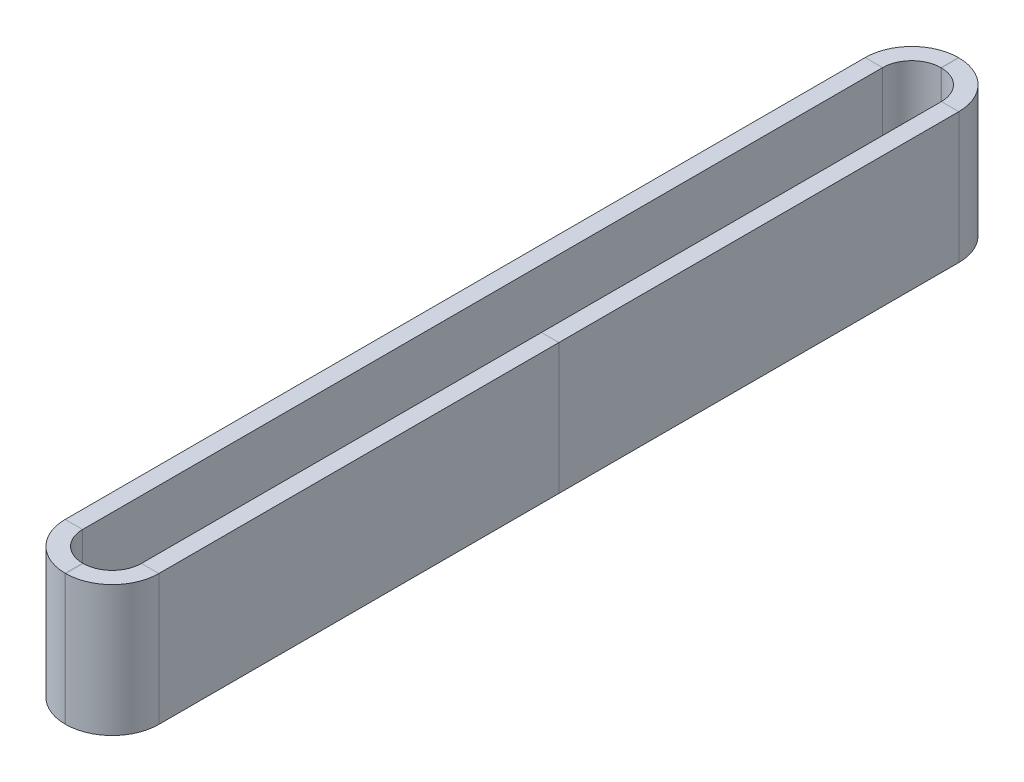
ISO-10303-21;
HEADER;
FILE_DESCRIPTION(('STEP AP214'),'2;1');
FILE_NAME('part.step','',(''),(''),'','','');
FILE_SCHEMA(('AUTOMOTIVE_DESIGN { 1 0 10303 214 1 1 1 1 }'));
ENDSEC;
DATA;
#1=APPLICATION_CONTEXT('core data for automotive mechanical design processes');
#2=APPLICATION_PROTOCOL_DEFINITION('international standard','automotive_design',2000,#1);
#3=PRODUCT_CONTEXT('',#1,'mechanical');
#4=PRODUCT('Part','Part','',(#3));
#5=PRODUCT_RELATED_PRODUCT_CATEGORY('part','',(#4));
#6=PRODUCT_DEFINITION_FORMATION('','',#4);
#7=PRODUCT_DEFINITION_CONTEXT('part definition',#1,'design');
#8=PRODUCT_DEFINITION('design','',#6,#7);
#9=PRODUCT_DEFINITION_SHAPE('','',#8);
#10=(LENGTH_UNIT() NAMED_UNIT(*) SI_UNIT(.MILLI.,.METRE.));
#11=(NAMED_UNIT(*) PLANE_ANGLE_UNIT() SI_UNIT($,.RADIAN.));
#12=(NAMED_UNIT(*) SI_UNIT($,.STERADIAN.) SOLID_ANGLE_UNIT());
#13=UNCERTAINTY_MEASURE_WITH_UNIT(LENGTH_MEASURE(1.E-05),#10,'distance_accuracy_value','');
#14=(GEOMETRIC_REPRESENTATION_CONTEXT(3) GLOBAL_UNCERTAINTY_ASSIGNED_CONTEXT((#13)) GLOBAL_UNIT_ASSIGNED_CONTEXT((#10,
#11,#12)) REPRESENTATION_CONTEXT('',''));
#15=CARTESIAN_POINT('',(0.,0.,0.));
#16=DIRECTION('',(0.,0.,1.));
#17=DIRECTION('',(1.,0.,0.));
#18=AXIS2_PLACEMENT_3D('',#15,#16,#17);
#19=CARTESIAN_POINT('',(6.74999999999997,15.,-91.7999999999999));
#20=DIRECTION('',(-1.,0.,0.));
#21=DIRECTION('',(0.,-1.,0.));
#22=AXIS2_PLACEMENT_3D('',#19,#20,#21);
#23=PLANE('',#22);
#24=DIRECTION('',(0.,0.,1.));
#25=VECTOR('',#24,1.);
#26=CARTESIAN_POINT('',(6.74999999999997,15.,-91.7999999999999));
#27=LINE('',#26,#25);
#28=CARTESIAN_POINT('',(6.74999999999997,15.,-91.7999999999999));
#29=VERTEX_POINT('',#28);
#30=CARTESIAN_POINT('',(6.74999999999998,15.,0.));
#31=VERTEX_POINT('',#30);
#32=EDGE_CURVE('E11',#29,#31,#27,.T.);
#33=ORIENTED_EDGE('',*,*,#32,.F.);
#34=DIRECTION('',(0.,-1.,0.));
#35=VECTOR('',#34,1.);
#36=CARTESIAN_POINT('',(6.74999999999997,15.,-91.7999999999999));
#37=LINE('',#36,#35);
#38=CARTESIAN_POINT('',(6.74999999999997,-15.,-91.7999999999999));
#39=VERTEX_POINT('',#38);
#40=EDGE_CURVE('E39',#29,#39,#37,.T.);
#41=ORIENTED_EDGE('',*,*,#40,.T.);
#42=DIRECTION('',(0.,0.,1.));
#43=VECTOR('',#42,1.);
#44=CARTESIAN_POINT('',(6.74999999999998,-15.,-91.7999999999999));
#45=LINE('',#44,#43);
#46=CARTESIAN_POINT('',(6.74999999999998,-15.,0.));
#47=VERTEX_POINT('',#46);
#48=EDGE_CURVE('E184',#39,#47,#45,.T.);
#49=ORIENTED_EDGE('',*,*,#48,.T.);
#50=DIRECTION('',(0.,-1.,0.));
#51=VECTOR('',#50,1.);
#52=CARTESIAN_POINT('',(6.74999999999998,15.,0.));
#53=LINE('',#52,#51);
#54=EDGE_CURVE('E187',#31,#47,#53,.T.);
#55=ORIENTED_EDGE('',*,*,#54,.F.);
#56=EDGE_LOOP('',(#33,#41,#49,#55));
#57=FACE_BOUND('',#56,.T.);
#58=ADVANCED_FACE('F36',(#57),#23,.T.);
#59=CARTESIAN_POINT('',(6.74999999999997,15.,-91.7999999999999));
#60=DIRECTION('',(0.,1.,0.));
#61=DIRECTION('',(0.,0.,1.));
#62=AXIS2_PLACEMENT_3D('',#59,#60,#61);
#63=PLANE('',#62);
#64=DIRECTION('',(0.,0.,1.));
#65=VECTOR('',#64,1.);
#66=CARTESIAN_POINT('',(10.75,15.,-91.7999999999999));
#67=LINE('',#66,#65);
#68=CARTESIAN_POINT('',(10.75,15.,-91.7999999999999));
#69=VERTEX_POINT('',#68);
#70=CARTESIAN_POINT('',(10.75,15.,0.));
#71=VERTEX_POINT('',#70);
#72=EDGE_CURVE('E44',#69,#71,#67,.T.);
#73=ORIENTED_EDGE('',*,*,#72,.F.);
#74=DIRECTION('',(1.,0.,0.));
#75=VECTOR('',#74,1.);
#76=CARTESIAN_POINT('',(6.74999999999997,15.,-91.7999999999999));
#77=LINE('',#76,#75);
#78=EDGE_CURVE('E337',#69,#29,#77,.F.);
#79=ORIENTED_EDGE('',*,*,#78,.T.);
#80=ORIENTED_EDGE('',*,*,#32,.T.);
#81=DIRECTION('',(1.,0.,0.));
#82=VECTOR('',#81,1.);
#83=CARTESIAN_POINT('',(6.74999999999998,15.,0.));
#84=LINE('',#83,#82);
#85=EDGE_CURVE('E212',#71,#31,#84,.F.);
#86=ORIENTED_EDGE('',*,*,#85,.F.);
#87=EDGE_LOOP('',(#73,#79,#80,#86));
#88=FACE_BOUND('',#87,.T.);
#89=ADVANCED_FACE('F459',(#88),#63,.T.);
#90=CARTESIAN_POINT('',(10.75,15.,-91.7999999999999));
#91=DIRECTION('',(1.,0.,0.));
#92=DIRECTION('',(0.,1.,0.));
#93=AXIS2_PLACEMENT_3D('',#90,#91,#92);
#94=PLANE('',#93);
#95=DIRECTION('',(0.,0.,1.));
#96=VECTOR('',#95,1.);
#97=CARTESIAN_POINT('',(10.75,-15.,-91.7999999999999));
#98=LINE('',#97,#96);
#99=CARTESIAN_POINT('',(10.75,-15.,-91.7999999999999));
#100=VERTEX_POINT('',#99);
#101=CARTESIAN_POINT('',(10.75,-15.,0.));
#102=VERTEX_POINT('',#101);
#103=EDGE_CURVE('E193',#100,#102,#98,.T.);
#104=ORIENTED_EDGE('',*,*,#103,.F.);
#105=DIRECTION('',(0.,-1.,0.));
#106=VECTOR('',#105,1.);
#107=CARTESIAN_POINT('',(10.75,15.,-91.7999999999999));
#108=LINE('',#107,#106);
#109=EDGE_CURVE('E293',#100,#69,#108,.F.);
#110=ORIENTED_EDGE('',*,*,#109,.T.);
#111=ORIENTED_EDGE('',*,*,#72,.T.);
#112=DIRECTION('',(0.,-1.,0.));
#113=VECTOR('',#112,1.);
#114=CARTESIAN_POINT('',(10.75,15.,0.));
#115=LINE('',#114,#113);
#116=EDGE_CURVE('E216',#102,#71,#115,.F.);
#117=ORIENTED_EDGE('',*,*,#116,.F.);
#118=EDGE_LOOP('',(#104,#110,#111,#117));
#119=FACE_BOUND('',#118,.T.);
#120=ADVANCED_FACE('F463',(#119),#94,.T.);
#121=CARTESIAN_POINT('',(0.0499999999999858,0.,-91.8));
#122=DIRECTION('',(0.,-1.,0.));
#123=DIRECTION('',(0.,0.,-1.));
#124=AXIS2_PLACEMENT_3D('',#121,#122,#123);
#125=CYLINDRICAL_SURFACE('',#124,6.69999999999998);
#126=ORIENTED_EDGE('',*,*,#40,.F.);
#127=CARTESIAN_POINT('',(0.0499999999999858,15.,-91.8));
#128=DIRECTION('',(0.,-1.,0.));
#129=DIRECTION('',(0.,0.,-1.));
#130=AXIS2_PLACEMENT_3D('',#127,#128,#129);
#131=CIRCLE('',#130,6.69999999999998);
#132=CARTESIAN_POINT('',(0.0500000000000689,15.,-98.5));
#133=VERTEX_POINT('',#132);
#134=EDGE_CURVE('E105',#133,#29,#131,.T.);
#135=ORIENTED_EDGE('',*,*,#134,.F.);
#136=DIRECTION('',(0.,-1.,0.));
#137=VECTOR('',#136,1.);
#138=CARTESIAN_POINT('',(0.0500000000000689,15.,-98.5));
#139=LINE('',#138,#137);
#140=CARTESIAN_POINT('',(0.0500000000000689,-15.,-98.5));
#141=VERTEX_POINT('',#140);
#142=EDGE_CURVE('E296',#133,#141,#139,.T.);
#143=ORIENTED_EDGE('',*,*,#142,.T.);
#144=CARTESIAN_POINT('',(0.0499999999999858,-15.,-91.8));
#145=DIRECTION('',(0.,-1.,0.));
#146=DIRECTION('',(0.,0.,-1.));
#147=AXIS2_PLACEMENT_3D('',#144,#145,#146);
#148=CIRCLE('',#147,6.69999999999998);
#149=EDGE_CURVE('E291',#141,#39,#148,.T.);
#150=ORIENTED_EDGE('',*,*,#149,.T.);
#151=EDGE_LOOP('',(#126,#135,#143,#150));
#152=FACE_BOUND('',#151,.T.);
#153=ADVANCED_FACE('F383',(#152),#125,.F.);
#154=CARTESIAN_POINT('',(0.0500000000000689,15.,-98.5));
#155=DIRECTION('',(0.,1.,0.));
#156=DIRECTION('',(0.,0.,1.));
#157=AXIS2_PLACEMENT_3D('',#154,#155,#156);
#158=PLANE('',#157);
#159=ORIENTED_EDGE('',*,*,#134,.T.);
#160=ORIENTED_EDGE('',*,*,#78,.F.);
#161=CARTESIAN_POINT('',(0.0499999999999858,15.,-91.8));
#162=DIRECTION('',(0.,-1.,0.));
#163=DIRECTION('',(0.,0.,-1.));
#164=AXIS2_PLACEMENT_3D('',#161,#162,#163);
#165=CIRCLE('',#164,10.7);
#166=CARTESIAN_POINT('',(0.0500000000000693,15.,-102.5));
#167=VERTEX_POINT('',#166);
#168=EDGE_CURVE('E114',#167,#69,#165,.T.);
#169=ORIENTED_EDGE('',*,*,#168,.F.);
#170=DIRECTION('',(0.,0.,-1.));
#171=VECTOR('',#170,1.);
#172=CARTESIAN_POINT('',(0.0500000000000689,15.,-98.5));
#173=LINE('',#172,#171);
#174=EDGE_CURVE('E333',#167,#133,#173,.F.);
#175=ORIENTED_EDGE('',*,*,#174,.T.);
#176=EDGE_LOOP('',(#159,#160,#169,#175));
#177=FACE_BOUND('',#176,.T.);
#178=ADVANCED_FACE('F460',(#177),#158,.T.);
#179=CARTESIAN_POINT('',(0.0499999999999858,0.,-91.8));
#180=DIRECTION('',(0.,-1.,0.));
#181=DIRECTION('',(0.,0.,-1.));
#182=AXIS2_PLACEMENT_3D('',#179,#180,#181);
#183=CYLINDRICAL_SURFACE('',#182,10.7);
#184=ORIENTED_EDGE('',*,*,#168,.T.);
#185=ORIENTED_EDGE('',*,*,#109,.F.);
#186=CARTESIAN_POINT('',(0.0499999999999858,-15.,-91.8));
#187=DIRECTION('',(0.,-1.,0.));
#188=DIRECTION('',(0.,0.,-1.));
#189=AXIS2_PLACEMENT_3D('',#186,#187,#188);
#190=CIRCLE('',#189,10.7);
#191=CARTESIAN_POINT('',(0.0500000000000693,-15.,-102.5));
#192=VERTEX_POINT('',#191);
#193=EDGE_CURVE('E122',#192,#100,#190,.T.);
#194=ORIENTED_EDGE('',*,*,#193,.F.);
#195=DIRECTION('',(0.,-1.,0.));
#196=VECTOR('',#195,1.);
#197=CARTESIAN_POINT('',(0.0500000000000693,15.,-102.5));
#198=LINE('',#197,#196);
#199=EDGE_CURVE('E285',#192,#167,#198,.F.);
#200=ORIENTED_EDGE('',*,*,#199,.T.);
#201=EDGE_LOOP('',(#184,#185,#194,#200));
#202=FACE_BOUND('',#201,.T.);
#203=ADVANCED_FACE('F461',(#202),#183,.T.);
#204=CARTESIAN_POINT('',(0.0500000000000689,-15.,-98.5));
#205=DIRECTION('',(0.,-1.,0.));
#206=DIRECTION('',(0.,0.,-1.));
#207=AXIS2_PLACEMENT_3D('',#204,#205,#206);
#208=PLANE('',#207);
#209=ORIENTED_EDGE('',*,*,#193,.T.);
#210=DIRECTION('',(1.,0.,0.));
#211=VECTOR('',#210,1.);
#212=CARTESIAN_POINT('',(6.74999999999998,-15.,-91.7999999999999));
#213=LINE('',#212,#211);
#214=EDGE_CURVE('E289',#39,#100,#213,.T.);
#215=ORIENTED_EDGE('',*,*,#214,.F.);
#216=ORIENTED_EDGE('',*,*,#149,.F.);
#217=DIRECTION('',(0.,0.,-1.));
#218=VECTOR('',#217,1.);
#219=CARTESIAN_POINT('',(0.0500000000000689,-15.,-98.5));
#220=LINE('',#219,#218);
#221=EDGE_CURVE('E280',#141,#192,#220,.T.);
#222=ORIENTED_EDGE('',*,*,#221,.T.);
#223=EDGE_LOOP('',(#209,#215,#216,#222));
#224=FACE_BOUND('',#223,.T.);
#225=ADVANCED_FACE('F507',(#224),#208,.T.);
#226=CARTESIAN_POINT('',(-0.0499999999998746,15.,-98.5));
#227=DIRECTION('',(0.,0.,1.));
#228=DIRECTION('',(0.,-1.,0.));
#229=AXIS2_PLACEMENT_3D('',#226,#227,#228);
#230=PLANE('',#229);
#231=ORIENTED_EDGE('',*,*,#142,.F.);
#232=DIRECTION('',(1.,0.,0.));
#233=VECTOR('',#232,1.);
#234=CARTESIAN_POINT('',(-0.0499999999998746,15.,-98.5));
#235=LINE('',#234,#233);
#236=CARTESIAN_POINT('',(-0.04999999999989,15.,-98.5));
#237=VERTEX_POINT('',#236);
#238=EDGE_CURVE('E366',#237,#133,#235,.T.);
#239=ORIENTED_EDGE('',*,*,#238,.F.);
#240=DIRECTION('',(0.,-1.,0.));
#241=VECTOR('',#240,1.);
#242=CARTESIAN_POINT('',(-0.0499999999998907,15.,-98.5));
#243=LINE('',#242,#241);
#244=CARTESIAN_POINT('',(-0.04999999999989,-15.,-98.5));
#245=VERTEX_POINT('',#244);
#246=EDGE_CURVE('E288',#237,#245,#243,.T.);
#247=ORIENTED_EDGE('',*,*,#246,.T.);
#248=DIRECTION('',(1.,0.,0.));
#249=VECTOR('',#248,1.);
#250=CARTESIAN_POINT('',(-0.0499999999998746,-15.,-98.5));
#251=LINE('',#250,#249);
#252=EDGE_CURVE('E283',#245,#141,#251,.T.);
#253=ORIENTED_EDGE('',*,*,#252,.T.);
#254=EDGE_LOOP('',(#231,#239,#247,#253));
#255=FACE_BOUND('',#254,.T.);
#256=ADVANCED_FACE('F388',(#255),#230,.T.);
#257=CARTESIAN_POINT('',(-0.0499999999998746,15.,-98.5));
#258=DIRECTION('',(0.,1.,0.));
#259=DIRECTION('',(0.,0.,1.));
#260=AXIS2_PLACEMENT_3D('',#257,#258,#259);
#261=PLANE('',#260);
#262=ORIENTED_EDGE('',*,*,#238,.T.);
#263=ORIENTED_EDGE('',*,*,#174,.F.);
#264=DIRECTION('',(1.,0.,0.));
#265=VECTOR('',#264,1.);
#266=CARTESIAN_POINT('',(-0.0499999999998741,15.,-102.5));
#267=LINE('',#266,#265);
#268=CARTESIAN_POINT('',(-0.0499999999998624,15.,-102.5));
#269=VERTEX_POINT('',#268);
#270=EDGE_CURVE('E149',#269,#167,#267,.T.);
#271=ORIENTED_EDGE('',*,*,#270,.F.);
#272=DIRECTION('',(0.,0.,-1.));
#273=VECTOR('',#272,1.);
#274=CARTESIAN_POINT('',(-0.0499999999998907,15.,-98.5));
#275=LINE('',#274,#273);
#276=EDGE_CURVE('E330',#269,#237,#275,.F.);
#277=ORIENTED_EDGE('',*,*,#276,.T.);
#278=EDGE_LOOP('',(#262,#263,#271,#277));
#279=FACE_BOUND('',#278,.T.);
#280=ADVANCED_FACE('F523',(#279),#261,.T.);
#281=CARTESIAN_POINT('',(-0.0499999999998741,15.,-102.5));
#282=DIRECTION('',(0.,0.,-1.));
#283=DIRECTION('',(0.,1.,0.));
#284=AXIS2_PLACEMENT_3D('',#281,#282,#283);
#285=PLANE('',#284);
#286=ORIENTED_EDGE('',*,*,#270,.T.);
#287=ORIENTED_EDGE('',*,*,#199,.F.);
#288=DIRECTION('',(1.,0.,0.));
#289=VECTOR('',#288,1.);
#290=CARTESIAN_POINT('',(-0.0499999999998741,-15.,-102.5));
#291=LINE('',#290,#289);
#292=CARTESIAN_POINT('',(-0.0499999999998624,-15.,-102.5));
#293=VERTEX_POINT('',#292);
#294=EDGE_CURVE('E155',#293,#192,#291,.T.);
#295=ORIENTED_EDGE('',*,*,#294,.F.);
#296=DIRECTION('',(0.,-1.,0.));
#297=VECTOR('',#296,1.);
#298=CARTESIAN_POINT('',(-0.0499999999998623,15.,-102.5));
#299=LINE('',#298,#297);
#300=EDGE_CURVE('E276',#293,#269,#299,.F.);
#301=ORIENTED_EDGE('',*,*,#300,.T.);
#302=EDGE_LOOP('',(#286,#287,#295,#301));
#303=FACE_BOUND('',#302,.T.);
#304=ADVANCED_FACE('F532',(#303),#285,.T.);
#305=CARTESIAN_POINT('',(-0.0499999999998746,-15.,-98.5));
#306=DIRECTION('',(0.,-1.,0.));
#307=DIRECTION('',(0.,0.,-1.));
#308=AXIS2_PLACEMENT_3D('',#305,#306,#307);
#309=PLANE('',#308);
#310=ORIENTED_EDGE('',*,*,#294,.T.);
#311=ORIENTED_EDGE('',*,*,#221,.F.);
#312=ORIENTED_EDGE('',*,*,#252,.F.);
#313=DIRECTION('',(0.,0.,-1.));
#314=VECTOR('',#313,1.);
#315=CARTESIAN_POINT('',(-0.0499999999998907,-15.,-98.5));
#316=LINE('',#315,#314);
#317=EDGE_CURVE('E269',#245,#293,#316,.T.);
#318=ORIENTED_EDGE('',*,*,#317,.T.);
#319=EDGE_LOOP('',(#310,#311,#312,#318));
#320=FACE_BOUND('',#319,.T.);
#321=ADVANCED_FACE('F386',(#320),#309,.T.);
#322=CARTESIAN_POINT('',(-0.0500000000000205,0.,-91.8));
#323=DIRECTION('',(0.,-1.,0.));
#324=DIRECTION('',(0.,0.,-1.));
#325=AXIS2_PLACEMENT_3D('',#322,#323,#324);
#326=CYLINDRICAL_SURFACE('',#325,6.69999999999999);
#327=ORIENTED_EDGE('',*,*,#246,.F.);
#328=CARTESIAN_POINT('',(-0.0500000000000205,15.,-91.8));
#329=DIRECTION('',(0.,-1.,0.));
#330=DIRECTION('',(-1.,0.,0.));
#331=AXIS2_PLACEMENT_3D('',#328,#329,#330);
#332=CIRCLE('',#331,6.69999999999999);
#333=CARTESIAN_POINT('',(-6.75,15.,-91.8));
#334=VERTEX_POINT('',#333);
#335=EDGE_CURVE('E362',#334,#237,#332,.T.);
#336=ORIENTED_EDGE('',*,*,#335,.F.);
#337=DIRECTION('',(0.,-1.,0.));
#338=VECTOR('',#337,1.);
#339=CARTESIAN_POINT('',(-6.75,15.,-91.8000000000001));
#340=LINE('',#339,#338);
#341=CARTESIAN_POINT('',(-6.75000000000001,-15.,-91.8));
#342=VERTEX_POINT('',#341);
#343=EDGE_CURVE('E279',#334,#342,#340,.T.);
#344=ORIENTED_EDGE('',*,*,#343,.T.);
#345=CARTESIAN_POINT('',(-0.0500000000000205,-15.,-91.8));
#346=DIRECTION('',(0.,-1.,0.));
#347=DIRECTION('',(-1.,0.,0.));
#348=AXIS2_PLACEMENT_3D('',#345,#346,#347);
#349=CIRCLE('',#348,6.69999999999999);
#350=EDGE_CURVE('E273',#342,#245,#349,.T.);
#351=ORIENTED_EDGE('',*,*,#350,.T.);
#352=EDGE_LOOP('',(#327,#336,#344,#351));
#353=FACE_BOUND('',#352,.T.);
#354=ADVANCED_FACE('F397',(#353),#326,.F.);
#355=CARTESIAN_POINT('',(-6.75000000000001,15.,-91.8000000000001));
#356=DIRECTION('',(0.,1.,0.));
#357=DIRECTION('',(0.,0.,1.));
#358=AXIS2_PLACEMENT_3D('',#355,#356,#357);
#359=PLANE('',#358);
#360=ORIENTED_EDGE('',*,*,#335,.T.);
#361=ORIENTED_EDGE('',*,*,#276,.F.);
#362=CARTESIAN_POINT('',(-0.0500000000000205,15.,-91.8));
#363=DIRECTION('',(0.,-1.,0.));
#364=DIRECTION('',(-1.,0.,0.));
#365=AXIS2_PLACEMENT_3D('',#362,#363,#364);
#366=CIRCLE('',#365,10.7);
#367=CARTESIAN_POINT('',(-10.75,15.,-91.8));
#368=VERTEX_POINT('',#367);
#369=EDGE_CURVE('E327',#368,#269,#366,.T.);
#370=ORIENTED_EDGE('',*,*,#369,.F.);
#371=DIRECTION('',(-1.,0.,0.));
#372=VECTOR('',#371,1.);
#373=CARTESIAN_POINT('',(-6.75,15.,-91.8000000000001));
#374=LINE('',#373,#372);
#375=EDGE_CURVE('E324',#368,#334,#374,.F.);
#376=ORIENTED_EDGE('',*,*,#375,.T.);
#377=EDGE_LOOP('',(#360,#361,#370,#376));
#378=FACE_BOUND('',#377,.T.);
#379=ADVANCED_FACE('F415',(#378),#359,.T.);
#380=CARTESIAN_POINT('',(-0.0500000000000205,0.,-91.8));
#381=DIRECTION('',(0.,-1.,0.));
#382=DIRECTION('',(0.,0.,-1.));
#383=AXIS2_PLACEMENT_3D('',#380,#381,#382);
#384=CYLINDRICAL_SURFACE('',#383,10.7);
#385=ORIENTED_EDGE('',*,*,#369,.T.);
#386=ORIENTED_EDGE('',*,*,#300,.F.);
#387=CARTESIAN_POINT('',(-0.0500000000000205,-15.,-91.8));
#388=DIRECTION('',(0.,-1.,0.));
#389=DIRECTION('',(-1.,0.,0.));
#390=AXIS2_PLACEMENT_3D('',#387,#388,#389);
#391=CIRCLE('',#390,10.7);
#392=CARTESIAN_POINT('',(-10.75,-15.,-91.8));
#393=VERTEX_POINT('',#392);
#394=EDGE_CURVE('E272',#393,#293,#391,.T.);
#395=ORIENTED_EDGE('',*,*,#394,.F.);
#396=DIRECTION('',(0.,-1.,0.));
#397=VECTOR('',#396,1.);
#398=CARTESIAN_POINT('',(-10.75,15.,-91.8000000000001));
#399=LINE('',#398,#397);
#400=EDGE_CURVE('E261',#393,#368,#399,.F.);
#401=ORIENTED_EDGE('',*,*,#400,.T.);
#402=EDGE_LOOP('',(#385,#386,#395,#401));
#403=FACE_BOUND('',#402,.T.);
#404=ADVANCED_FACE('F408',(#403),#384,.T.);
#405=CARTESIAN_POINT('',(-6.75000000000001,-15.,-91.8000000000001));
#406=DIRECTION('',(0.,-1.,0.));
#407=DIRECTION('',(0.,0.,-1.));
#408=AXIS2_PLACEMENT_3D('',#405,#406,#407);
#409=PLANE('',#408);
#410=ORIENTED_EDGE('',*,*,#394,.T.);
#411=ORIENTED_EDGE('',*,*,#317,.F.);
#412=ORIENTED_EDGE('',*,*,#350,.F.);
#413=DIRECTION('',(-1.,0.,0.));
#414=VECTOR('',#413,1.);
#415=CARTESIAN_POINT('',(-6.75000000000001,-15.,-91.8000000000001));
#416=LINE('',#415,#414);
#417=EDGE_CURVE('E258',#342,#393,#416,.T.);
#418=ORIENTED_EDGE('',*,*,#417,.T.);
#419=EDGE_LOOP('',(#410,#411,#412,#418));
#420=FACE_BOUND('',#419,.T.);
#421=ADVANCED_FACE('F395',(#420),#409,.T.);
#422=CARTESIAN_POINT('',(-6.74999999999998,15.,91.7999999999997));
#423=DIRECTION('',(1.,0.,0.));
#424=DIRECTION('',(0.,0.,-1.));
#425=AXIS2_PLACEMENT_3D('',#422,#423,#424);
#426=PLANE('',#425);
#427=ORIENTED_EDGE('',*,*,#343,.F.);
#428=DIRECTION('',(0.,0.,-1.));
#429=VECTOR('',#428,1.);
#430=CARTESIAN_POINT('',(-6.74999999999998,15.,91.7999999999997));
#431=LINE('',#430,#429);
#432=CARTESIAN_POINT('',(-6.74999999999998,15.,91.7999999999998));
#433=VERTEX_POINT('',#432);
#434=EDGE_CURVE('E262',#433,#334,#431,.T.);
#435=ORIENTED_EDGE('',*,*,#434,.F.);
#436=DIRECTION('',(0.,-1.,0.));
#437=VECTOR('',#436,1.);
#438=CARTESIAN_POINT('',(-6.74999999999998,15.,91.7999999999998));
#439=LINE('',#438,#437);
#440=CARTESIAN_POINT('',(-6.74999999999998,-15.,91.7999999999998));
#441=VERTEX_POINT('',#440);
#442=EDGE_CURVE('E268',#433,#441,#439,.T.);
#443=ORIENTED_EDGE('',*,*,#442,.T.);
#444=DIRECTION('',(0.,0.,-1.));
#445=VECTOR('',#444,1.);
#446=CARTESIAN_POINT('',(-6.74999999999998,-15.,91.7999999999997));
#447=LINE('',#446,#445);
#448=EDGE_CURVE('E266',#441,#342,#447,.T.);
#449=ORIENTED_EDGE('',*,*,#448,.T.);
#450=EDGE_LOOP('',(#427,#435,#443,#449));
#451=FACE_BOUND('',#450,.T.);
#452=ADVANCED_FACE('F418',(#451),#426,.T.);
#453=CARTESIAN_POINT('',(-6.74999999999998,15.,91.7999999999997));
#454=DIRECTION('',(0.,1.,0.));
#455=DIRECTION('',(0.,0.,1.));
#456=AXIS2_PLACEMENT_3D('',#453,#454,#455);
#457=PLANE('',#456);
#458=ORIENTED_EDGE('',*,*,#434,.T.);
#459=ORIENTED_EDGE('',*,*,#375,.F.);
#460=DIRECTION('',(0.,0.,-1.));
#461=VECTOR('',#460,1.);
#462=CARTESIAN_POINT('',(-10.75,15.,91.7999999999997));
#463=LINE('',#462,#461);
#464=CARTESIAN_POINT('',(-10.75,15.,91.7999999999997));
#465=VERTEX_POINT('',#464);
#466=EDGE_CURVE('E265',#465,#368,#463,.T.);
#467=ORIENTED_EDGE('',*,*,#466,.F.);
#468=DIRECTION('',(-1.,0.,0.));
#469=VECTOR('',#468,1.);
#470=CARTESIAN_POINT('',(-6.74999999999998,15.,91.7999999999998));
#471=LINE('',#470,#469);
#472=EDGE_CURVE('E321',#465,#433,#471,.F.);
#473=ORIENTED_EDGE('',*,*,#472,.T.);
#474=EDGE_LOOP('',(#458,#459,#467,#473));
#475=FACE_BOUND('',#474,.T.);
#476=ADVANCED_FACE('F416',(#475),#457,.T.);
#477=CARTESIAN_POINT('',(-10.75,15.,91.7999999999997));
#478=DIRECTION('',(-1.,0.,0.));
#479=DIRECTION('',(0.,0.,1.));
#480=AXIS2_PLACEMENT_3D('',#477,#478,#479);
#481=PLANE('',#480);
#482=ORIENTED_EDGE('',*,*,#466,.T.);
#483=ORIENTED_EDGE('',*,*,#400,.F.);
#484=DIRECTION('',(0.,0.,-1.));
#485=VECTOR('',#484,1.);
#486=CARTESIAN_POINT('',(-10.75,-15.,91.7999999999997));
#487=LINE('',#486,#485);
#488=CARTESIAN_POINT('',(-10.75,-15.,91.7999999999997));
#489=VERTEX_POINT('',#488);
#490=EDGE_CURVE('E263',#489,#393,#487,.T.);
#491=ORIENTED_EDGE('',*,*,#490,.F.);
#492=DIRECTION('',(0.,-1.,0.));
#493=VECTOR('',#492,1.);
#494=CARTESIAN_POINT('',(-10.75,15.,91.7999999999997));
#495=LINE('',#494,#493);
#496=EDGE_CURVE('E254',#489,#465,#495,.F.);
#497=ORIENTED_EDGE('',*,*,#496,.T.);
#498=EDGE_LOOP('',(#482,#483,#491,#497));
#499=FACE_BOUND('',#498,.T.);
#500=ADVANCED_FACE('F409',(#499),#481,.T.);
#501=CARTESIAN_POINT('',(-6.74999999999998,-15.,91.7999999999997));
#502=DIRECTION('',(0.,-1.,0.));
#503=DIRECTION('',(0.,0.,-1.));
#504=AXIS2_PLACEMENT_3D('',#501,#502,#503);
#505=PLANE('',#504);
#506=ORIENTED_EDGE('',*,*,#490,.T.);
#507=ORIENTED_EDGE('',*,*,#417,.F.);
#508=ORIENTED_EDGE('',*,*,#448,.F.);
#509=DIRECTION('',(-1.,0.,0.));
#510=VECTOR('',#509,1.);
#511=CARTESIAN_POINT('',(-6.74999999999998,-15.,91.7999999999998));
#512=LINE('',#511,#510);
#513=EDGE_CURVE('E247',#441,#489,#512,.T.);
#514=ORIENTED_EDGE('',*,*,#513,.T.);
#515=EDGE_LOOP('',(#506,#507,#508,#514));
#516=FACE_BOUND('',#515,.T.);
#517=ADVANCED_FACE('F402',(#516),#505,.T.);
#518=CARTESIAN_POINT('',(-0.0499999999999962,0.,91.8));
#519=DIRECTION('',(0.,-1.,0.));
#520=DIRECTION('',(0.,0.,-1.));
#521=AXIS2_PLACEMENT_3D('',#518,#519,#520);
#522=CYLINDRICAL_SURFACE('',#521,6.69999999999998);
#523=ORIENTED_EDGE('',*,*,#442,.F.);
#524=CARTESIAN_POINT('',(-0.0499999999999962,15.,91.8));
#525=DIRECTION('',(0.,-1.,0.));
#526=DIRECTION('',(0.,0.,1.));
#527=AXIS2_PLACEMENT_3D('',#524,#525,#526);
#528=CIRCLE('',#527,6.69999999999998);
#529=CARTESIAN_POINT('',(-0.0500000000000793,15.,98.5));
#530=VERTEX_POINT('',#529);
#531=EDGE_CURVE('E355',#530,#433,#528,.T.);
#532=ORIENTED_EDGE('',*,*,#531,.F.);
#533=DIRECTION('',(0.,-1.,0.));
#534=VECTOR('',#533,1.);
#535=CARTESIAN_POINT('',(-0.0500000000000793,15.,98.5));
#536=LINE('',#535,#534);
#537=CARTESIAN_POINT('',(-0.0500000000000793,-15.,98.5));
#538=VERTEX_POINT('',#537);
#539=EDGE_CURVE('E257',#530,#538,#536,.T.);
#540=ORIENTED_EDGE('',*,*,#539,.T.);
#541=CARTESIAN_POINT('',(-0.0499999999999962,-15.,91.8));
#542=DIRECTION('',(0.,-1.,0.));
#543=DIRECTION('',(0.,0.,1.));
#544=AXIS2_PLACEMENT_3D('',#541,#542,#543);
#545=CIRCLE('',#544,6.69999999999998);
#546=EDGE_CURVE('E251',#538,#441,#545,.T.);
#547=ORIENTED_EDGE('',*,*,#546,.T.);
#548=EDGE_LOOP('',(#523,#532,#540,#547));
#549=FACE_BOUND('',#548,.T.);
#550=ADVANCED_FACE('F420',(#549),#522,.F.);
#551=CARTESIAN_POINT('',(-0.0500000000000793,15.,98.5));
#552=DIRECTION('',(0.,1.,0.));
#553=DIRECTION('',(0.,0.,1.));
#554=AXIS2_PLACEMENT_3D('',#551,#552,#553);
#555=PLANE('',#554);
#556=ORIENTED_EDGE('',*,*,#531,.T.);
#557=ORIENTED_EDGE('',*,*,#472,.F.);
#558=CARTESIAN_POINT('',(-0.0499999999999962,15.,91.8));
#559=DIRECTION('',(0.,-1.,0.));
#560=DIRECTION('',(0.,0.,1.));
#561=AXIS2_PLACEMENT_3D('',#558,#559,#560);
#562=CIRCLE('',#561,10.7);
#563=CARTESIAN_POINT('',(-0.0500000000000797,15.,102.5));
#564=VERTEX_POINT('',#563);
#565=EDGE_CURVE('E318',#564,#465,#562,.T.);
#566=ORIENTED_EDGE('',*,*,#565,.F.);
#567=DIRECTION('',(0.,0.,1.));
#568=VECTOR('',#567,1.);
#569=CARTESIAN_POINT('',(-0.0500000000000793,15.,98.5));
#570=LINE('',#569,#568);
#571=EDGE_CURVE('E315',#564,#530,#570,.F.);
#572=ORIENTED_EDGE('',*,*,#571,.T.);
#573=EDGE_LOOP('',(#556,#557,#566,#572));
#574=FACE_BOUND('',#573,.T.);
#575=ADVANCED_FACE('F423',(#574),#555,.T.);
#576=CARTESIAN_POINT('',(-0.0499999999999962,0.,91.8));
#577=DIRECTION('',(0.,-1.,0.));
#578=DIRECTION('',(0.,0.,-1.));
#579=AXIS2_PLACEMENT_3D('',#576,#577,#578);
#580=CYLINDRICAL_SURFACE('',#579,10.7);
#581=ORIENTED_EDGE('',*,*,#565,.T.);
#582=ORIENTED_EDGE('',*,*,#496,.F.);
#583=CARTESIAN_POINT('',(-0.0499999999999962,-15.,91.8));
#584=DIRECTION('',(0.,-1.,0.));
#585=DIRECTION('',(0.,0.,1.));
#586=AXIS2_PLACEMENT_3D('',#583,#584,#585);
#587=CIRCLE('',#586,10.7);
#588=CARTESIAN_POINT('',(-0.0500000000000797,-15.,102.5));
#589=VERTEX_POINT('',#588);
#590=EDGE_CURVE('E250',#589,#489,#587,.T.);
#591=ORIENTED_EDGE('',*,*,#590,.F.);
#592=DIRECTION('',(0.,-1.,0.));
#593=VECTOR('',#592,1.);
#594=CARTESIAN_POINT('',(-0.0500000000000797,15.,102.5));
#595=LINE('',#594,#593);
#596=EDGE_CURVE('E243',#589,#564,#595,.F.);
#597=ORIENTED_EDGE('',*,*,#596,.T.);
#598=EDGE_LOOP('',(#581,#582,#591,#597));
#599=FACE_BOUND('',#598,.T.);
#600=ADVANCED_FACE('F433',(#599),#580,.T.);
#601=CARTESIAN_POINT('',(-0.0500000000000793,-15.,98.5));
#602=DIRECTION('',(0.,-1.,0.));
#603=DIRECTION('',(0.,0.,-1.));
#604=AXIS2_PLACEMENT_3D('',#601,#602,#603);
#605=PLANE('',#604);
#606=ORIENTED_EDGE('',*,*,#590,.T.);
#607=ORIENTED_EDGE('',*,*,#513,.F.);
#608=ORIENTED_EDGE('',*,*,#546,.F.);
#609=DIRECTION('',(0.,0.,1.));
#610=VECTOR('',#609,1.);
#611=CARTESIAN_POINT('',(-0.0500000000000793,-15.,98.5));
#612=LINE('',#611,#610);
#613=EDGE_CURVE('E236',#538,#589,#612,.T.);
#614=ORIENTED_EDGE('',*,*,#613,.T.);
#615=EDGE_LOOP('',(#606,#607,#608,#614));
#616=FACE_BOUND('',#615,.T.);
#617=ADVANCED_FACE('F435',(#616),#605,.T.);
#618=CARTESIAN_POINT('',(0.0499999999998663,15.,98.5));
#619=DIRECTION('',(0.,0.,-1.));
#620=DIRECTION('',(0.,1.,0.));
#621=AXIS2_PLACEMENT_3D('',#618,#619,#620);
#622=PLANE('',#621);
#623=ORIENTED_EDGE('',*,*,#539,.F.);
#624=DIRECTION('',(-1.,0.,0.));
#625=VECTOR('',#624,1.);
#626=CARTESIAN_POINT('',(0.0499999999998663,15.,98.5));
#627=LINE('',#626,#625);
#628=CARTESIAN_POINT('',(0.0499999999998809,15.,98.5));
#629=VERTEX_POINT('',#628);
#630=EDGE_CURVE('E350',#629,#530,#627,.T.);
#631=ORIENTED_EDGE('',*,*,#630,.F.);
#632=DIRECTION('',(0.,-1.,0.));
#633=VECTOR('',#632,1.);
#634=CARTESIAN_POINT('',(0.0499999999998815,15.,98.5));
#635=LINE('',#634,#633);
#636=CARTESIAN_POINT('',(0.0499999999998809,-15.,98.5));
#637=VERTEX_POINT('',#636);
#638=EDGE_CURVE('E246',#629,#637,#635,.T.);
#639=ORIENTED_EDGE('',*,*,#638,.T.);
#640=DIRECTION('',(-1.,0.,0.));
#641=VECTOR('',#640,1.);
#642=CARTESIAN_POINT('',(0.0499999999998663,-15.,98.5));
#643=LINE('',#642,#641);
#644=EDGE_CURVE('E240',#637,#538,#643,.T.);
#645=ORIENTED_EDGE('',*,*,#644,.T.);
#646=EDGE_LOOP('',(#623,#631,#639,#645));
#647=FACE_BOUND('',#646,.T.);
#648=ADVANCED_FACE('F440',(#647),#622,.T.);
#649=CARTESIAN_POINT('',(0.0499999999998663,15.,98.5));
#650=DIRECTION('',(0.,1.,0.));
#651=DIRECTION('',(0.,0.,1.));
#652=AXIS2_PLACEMENT_3D('',#649,#650,#651);
#653=PLANE('',#652);
#654=ORIENTED_EDGE('',*,*,#630,.T.);
#655=ORIENTED_EDGE('',*,*,#571,.F.);
#656=DIRECTION('',(-1.,0.,0.));
#657=VECTOR('',#656,1.);
#658=CARTESIAN_POINT('',(0.0499999999998659,15.,102.5));
#659=LINE('',#658,#657);
#660=CARTESIAN_POINT('',(0.0499999999998545,15.,102.5));
#661=VERTEX_POINT('',#660);
#662=EDGE_CURVE('E312',#661,#564,#659,.T.);
#663=ORIENTED_EDGE('',*,*,#662,.F.);
#664=DIRECTION('',(0.,0.,1.));
#665=VECTOR('',#664,1.);
#666=CARTESIAN_POINT('',(0.0499999999998815,15.,98.5));
#667=LINE('',#666,#665);
#668=EDGE_CURVE('E309',#661,#629,#667,.F.);
#669=ORIENTED_EDGE('',*,*,#668,.T.);
#670=EDGE_LOOP('',(#654,#655,#663,#669));
#671=FACE_BOUND('',#670,.T.);
#672=ADVANCED_FACE('F426',(#671),#653,.T.);
#673=CARTESIAN_POINT('',(0.0499999999998659,15.,102.5));
#674=DIRECTION('',(0.,0.,1.));
#675=DIRECTION('',(0.,-1.,0.));
#676=AXIS2_PLACEMENT_3D('',#673,#674,#675);
#677=PLANE('',#676);
#678=ORIENTED_EDGE('',*,*,#662,.T.);
#679=ORIENTED_EDGE('',*,*,#596,.F.);
#680=DIRECTION('',(-1.,0.,0.));
#681=VECTOR('',#680,1.);
#682=CARTESIAN_POINT('',(0.0499999999998659,-15.,102.5));
#683=LINE('',#682,#681);
#684=CARTESIAN_POINT('',(0.0499999999998545,-15.,102.5));
#685=VERTEX_POINT('',#684);
#686=EDGE_CURVE('E239',#685,#589,#683,.T.);
#687=ORIENTED_EDGE('',*,*,#686,.F.);
#688=DIRECTION('',(0.,-1.,0.));
#689=VECTOR('',#688,1.);
#690=CARTESIAN_POINT('',(0.0499999999998549,15.,102.5));
#691=LINE('',#690,#689);
#692=EDGE_CURVE('E232',#685,#661,#691,.F.);
#693=ORIENTED_EDGE('',*,*,#692,.T.);
#694=EDGE_LOOP('',(#678,#679,#687,#693));
#695=FACE_BOUND('',#694,.T.);
#696=ADVANCED_FACE('F430',(#695),#677,.T.);
#697=CARTESIAN_POINT('',(0.0499999999998663,-15.,98.5));
#698=DIRECTION('',(0.,-1.,0.));
#699=DIRECTION('',(0.,0.,-1.));
#700=AXIS2_PLACEMENT_3D('',#697,#698,#699);
#701=PLANE('',#700);
#702=ORIENTED_EDGE('',*,*,#686,.T.);
#703=ORIENTED_EDGE('',*,*,#613,.F.);
#704=ORIENTED_EDGE('',*,*,#644,.F.);
#705=DIRECTION('',(0.,0.,1.));
#706=VECTOR('',#705,1.);
#707=CARTESIAN_POINT('',(0.0499999999998815,-15.,98.5));
#708=LINE('',#707,#706);
#709=EDGE_CURVE('E225',#637,#685,#708,.T.);
#710=ORIENTED_EDGE('',*,*,#709,.T.);
#711=EDGE_LOOP('',(#702,#703,#704,#710));
#712=FACE_BOUND('',#711,.T.);
#713=ADVANCED_FACE('F438',(#712),#701,.T.);
#714=CARTESIAN_POINT('',(0.0500000000000084,0.,91.8));
#715=DIRECTION('',(0.,-1.,0.));
#716=DIRECTION('',(0.,0.,-1.));
#717=AXIS2_PLACEMENT_3D('',#714,#715,#716);
#718=CYLINDRICAL_SURFACE('',#717,6.69999999999999);
#719=ORIENTED_EDGE('',*,*,#638,.F.);
#720=CARTESIAN_POINT('',(0.0500000000000084,15.,91.8));
#721=DIRECTION('',(0.,-1.,0.));
#722=DIRECTION('',(1.,0.,0.));
#723=AXIS2_PLACEMENT_3D('',#720,#721,#722);
#724=CIRCLE('',#723,6.69999999999999);
#725=CARTESIAN_POINT('',(6.74999999999999,15.,91.7999999999999));
#726=VERTEX_POINT('',#725);
#727=EDGE_CURVE('E345',#726,#629,#724,.T.);
#728=ORIENTED_EDGE('',*,*,#727,.F.);
#729=DIRECTION('',(0.,-1.,0.));
#730=VECTOR('',#729,1.);
#731=CARTESIAN_POINT('',(6.74999999999999,15.,91.7999999999999));
#732=LINE('',#731,#730);
#733=CARTESIAN_POINT('',(6.75,-15.,91.7999999999999));
#734=VERTEX_POINT('',#733);
#735=EDGE_CURVE('E235',#726,#734,#732,.T.);
#736=ORIENTED_EDGE('',*,*,#735,.T.);
#737=CARTESIAN_POINT('',(0.0500000000000084,-15.,91.8));
#738=DIRECTION('',(0.,-1.,0.));
#739=DIRECTION('',(1.,0.,0.));
#740=AXIS2_PLACEMENT_3D('',#737,#738,#739);
#741=CIRCLE('',#740,6.69999999999999);
#742=EDGE_CURVE('E229',#734,#637,#741,.T.);
#743=ORIENTED_EDGE('',*,*,#742,.T.);
#744=EDGE_LOOP('',(#719,#728,#736,#743));
#745=FACE_BOUND('',#744,.T.);
#746=ADVANCED_FACE('F446',(#745),#718,.F.);
#747=CARTESIAN_POINT('',(6.74999999999999,15.,91.8000000000001));
#748=DIRECTION('',(0.,1.,0.));
#749=DIRECTION('',(0.,0.,1.));
#750=AXIS2_PLACEMENT_3D('',#747,#748,#749);
#751=PLANE('',#750);
#752=ORIENTED_EDGE('',*,*,#727,.T.);
#753=ORIENTED_EDGE('',*,*,#668,.F.);
#754=CARTESIAN_POINT('',(0.0500000000000084,15.,91.8));
#755=DIRECTION('',(0.,-1.,0.));
#756=DIRECTION('',(1.,0.,0.));
#757=AXIS2_PLACEMENT_3D('',#754,#755,#756);
#758=CIRCLE('',#757,10.7);
#759=CARTESIAN_POINT('',(10.75,15.,91.7999999999999));
#760=VERTEX_POINT('',#759);
#761=EDGE_CURVE('E306',#760,#661,#758,.T.);
#762=ORIENTED_EDGE('',*,*,#761,.F.);
#763=DIRECTION('',(1.,0.,0.));
#764=VECTOR('',#763,1.);
#765=CARTESIAN_POINT('',(6.74999999999999,15.,91.7999999999999));
#766=LINE('',#765,#764);
#767=EDGE_CURVE('E303',#760,#726,#766,.F.);
#768=ORIENTED_EDGE('',*,*,#767,.T.);
#769=EDGE_LOOP('',(#752,#753,#762,#768));
#770=FACE_BOUND('',#769,.T.);
#771=ADVANCED_FACE('F452',(#770),#751,.T.);
#772=CARTESIAN_POINT('',(0.0500000000000084,0.,91.8));
#773=DIRECTION('',(0.,-1.,0.));
#774=DIRECTION('',(0.,0.,-1.));
#775=AXIS2_PLACEMENT_3D('',#772,#773,#774);
#776=CYLINDRICAL_SURFACE('',#775,10.7);
#777=ORIENTED_EDGE('',*,*,#761,.T.);
#778=ORIENTED_EDGE('',*,*,#692,.F.);
#779=CARTESIAN_POINT('',(0.0500000000000084,-15.,91.8));
#780=DIRECTION('',(0.,-1.,0.));
#781=DIRECTION('',(1.,0.,0.));
#782=AXIS2_PLACEMENT_3D('',#779,#780,#781);
#783=CIRCLE('',#782,10.7);
#784=CARTESIAN_POINT('',(10.75,-15.,91.7999999999999));
#785=VERTEX_POINT('',#784);
#786=EDGE_CURVE('E228',#785,#685,#783,.T.);
#787=ORIENTED_EDGE('',*,*,#786,.F.);
#788=DIRECTION('',(0.,-1.,0.));
#789=VECTOR('',#788,1.);
#790=CARTESIAN_POINT('',(10.75,15.,91.7999999999999));
#791=LINE('',#790,#789);
#792=EDGE_CURVE('E223',#785,#760,#791,.F.);
#793=ORIENTED_EDGE('',*,*,#792,.T.);
#794=EDGE_LOOP('',(#777,#778,#787,#793));
#795=FACE_BOUND('',#794,.T.);
#796=ADVANCED_FACE('F454',(#795),#776,.T.);
#797=CARTESIAN_POINT('',(6.75,-15.,91.8000000000001));
#798=DIRECTION('',(0.,-1.,0.));
#799=DIRECTION('',(0.,0.,-1.));
#800=AXIS2_PLACEMENT_3D('',#797,#798,#799);
#801=PLANE('',#800);
#802=ORIENTED_EDGE('',*,*,#786,.T.);
#803=ORIENTED_EDGE('',*,*,#709,.F.);
#804=ORIENTED_EDGE('',*,*,#742,.F.);
#805=DIRECTION('',(1.,0.,0.));
#806=VECTOR('',#805,1.);
#807=CARTESIAN_POINT('',(6.75,-15.,91.7999999999999));
#808=LINE('',#807,#806);
#809=EDGE_CURVE('E204',#734,#785,#808,.T.);
#810=ORIENTED_EDGE('',*,*,#809,.T.);
#811=EDGE_LOOP('',(#802,#803,#804,#810));
#812=FACE_BOUND('',#811,.T.);
#813=ADVANCED_FACE('F445',(#812),#801,.T.);
#814=CARTESIAN_POINT('',(6.74999999999998,15.,0.));
#815=DIRECTION('',(-1.,0.,0.));
#816=DIRECTION('',(0.,-1.,0.));
#817=AXIS2_PLACEMENT_3D('',#814,#815,#816);
#818=PLANE('',#817);
#819=ORIENTED_EDGE('',*,*,#735,.F.);
#820=DIRECTION('',(0.,0.,1.));
#821=VECTOR('',#820,1.);
#822=CARTESIAN_POINT('',(6.74999999999998,15.,0.));
#823=LINE('',#822,#821);
#824=EDGE_CURVE('E211',#31,#726,#823,.T.);
#825=ORIENTED_EDGE('',*,*,#824,.F.);
#826=ORIENTED_EDGE('',*,*,#54,.T.);
#827=DIRECTION('',(0.,0.,1.));
#828=VECTOR('',#827,1.);
#829=CARTESIAN_POINT('',(6.74999999999998,-15.,0.));
#830=LINE('',#829,#828);
#831=EDGE_CURVE('E199',#47,#734,#830,.T.);
#832=ORIENTED_EDGE('',*,*,#831,.T.);
#833=EDGE_LOOP('',(#819,#825,#826,#832));
#834=FACE_BOUND('',#833,.T.);
#835=ADVANCED_FACE('F209',(#834),#818,.T.);
#836=CARTESIAN_POINT('',(6.74999999999998,15.,0.));
#837=DIRECTION('',(0.,1.,0.));
#838=DIRECTION('',(0.,0.,1.));
#839=AXIS2_PLACEMENT_3D('',#836,#837,#838);
#840=PLANE('',#839);
#841=ORIENTED_EDGE('',*,*,#824,.T.);
#842=ORIENTED_EDGE('',*,*,#767,.F.);
#843=DIRECTION('',(0.,0.,1.));
#844=VECTOR('',#843,1.);
#845=CARTESIAN_POINT('',(10.75,15.,0.));
#846=LINE('',#845,#844);
#847=EDGE_CURVE('E300',#71,#760,#846,.T.);
#848=ORIENTED_EDGE('',*,*,#847,.F.);
#849=ORIENTED_EDGE('',*,*,#85,.T.);
#850=EDGE_LOOP('',(#841,#842,#848,#849));
#851=FACE_BOUND('',#850,.T.);
#852=ADVANCED_FACE('F449',(#851),#840,.T.);
#853=CARTESIAN_POINT('',(10.75,15.,0.));
#854=DIRECTION('',(1.,0.,0.));
#855=DIRECTION('',(0.,1.,0.));
#856=AXIS2_PLACEMENT_3D('',#853,#854,#855);
#857=PLANE('',#856);
#858=ORIENTED_EDGE('',*,*,#847,.T.);
#859=ORIENTED_EDGE('',*,*,#792,.F.);
#860=DIRECTION('',(0.,0.,1.));
#861=VECTOR('',#860,1.);
#862=CARTESIAN_POINT('',(10.75,-15.,0.));
#863=LINE('',#862,#861);
#864=EDGE_CURVE('E222',#102,#785,#863,.T.);
#865=ORIENTED_EDGE('',*,*,#864,.F.);
#866=ORIENTED_EDGE('',*,*,#116,.T.);
#867=EDGE_LOOP('',(#858,#859,#865,#866));
#868=FACE_BOUND('',#867,.T.);
#869=ADVANCED_FACE('F457',(#868),#857,.T.);
#870=CARTESIAN_POINT('',(6.74999999999998,-15.,0.));
#871=DIRECTION('',(0.,-1.,0.));
#872=DIRECTION('',(0.,0.,-1.));
#873=AXIS2_PLACEMENT_3D('',#870,#871,#872);
#874=PLANE('',#873);
#875=ORIENTED_EDGE('',*,*,#864,.T.);
#876=ORIENTED_EDGE('',*,*,#809,.F.);
#877=ORIENTED_EDGE('',*,*,#831,.F.);
#878=DIRECTION('',(1.,0.,0.));
#879=VECTOR('',#878,1.);
#880=CARTESIAN_POINT('',(6.74999999999998,-15.,0.));
#881=LINE('',#880,#879);
#882=EDGE_CURVE('E202',#47,#102,#881,.T.);
#883=ORIENTED_EDGE('',*,*,#882,.T.);
#884=EDGE_LOOP('',(#875,#876,#877,#883));
#885=FACE_BOUND('',#884,.T.);
#886=ADVANCED_FACE('F201',(#885),#874,.T.);
#887=CARTESIAN_POINT('',(6.74999999999998,-15.,-91.7999999999999));
#888=DIRECTION('',(0.,-1.,0.));
#889=DIRECTION('',(0.,0.,-1.));
#890=AXIS2_PLACEMENT_3D('',#887,#888,#889);
#891=PLANE('',#890);
#892=ORIENTED_EDGE('',*,*,#214,.T.);
#893=ORIENTED_EDGE('',*,*,#103,.T.);
#894=ORIENTED_EDGE('',*,*,#882,.F.);
#895=ORIENTED_EDGE('',*,*,#48,.F.);
#896=EDGE_LOOP('',(#892,#893,#894,#895));
#897=FACE_BOUND('',#896,.T.);
#898=ADVANCED_FACE('F214',(#897),#891,.T.);
#899=CLOSED_SHELL('',(#58,#89,#120,#153,#178,#203,#225,#256,#280,#304,#321,#354,#379,#404,#421,
#452,#476,#500,#517,#550,#575,#600,#617,#648,#672,#696,#713,#746,#771,#796,#813,#835,#852,#869,
#886,#898));
#900=MANIFOLD_SOLID_BREP('B2',#899);
#901=ADVANCED_BREP_SHAPE_REPRESENTATION('',(#18,#900),#14);
#902=SHAPE_DEFINITION_REPRESENTATION(#9,#901);
ENDSEC;
END-ISO-10303-21;
